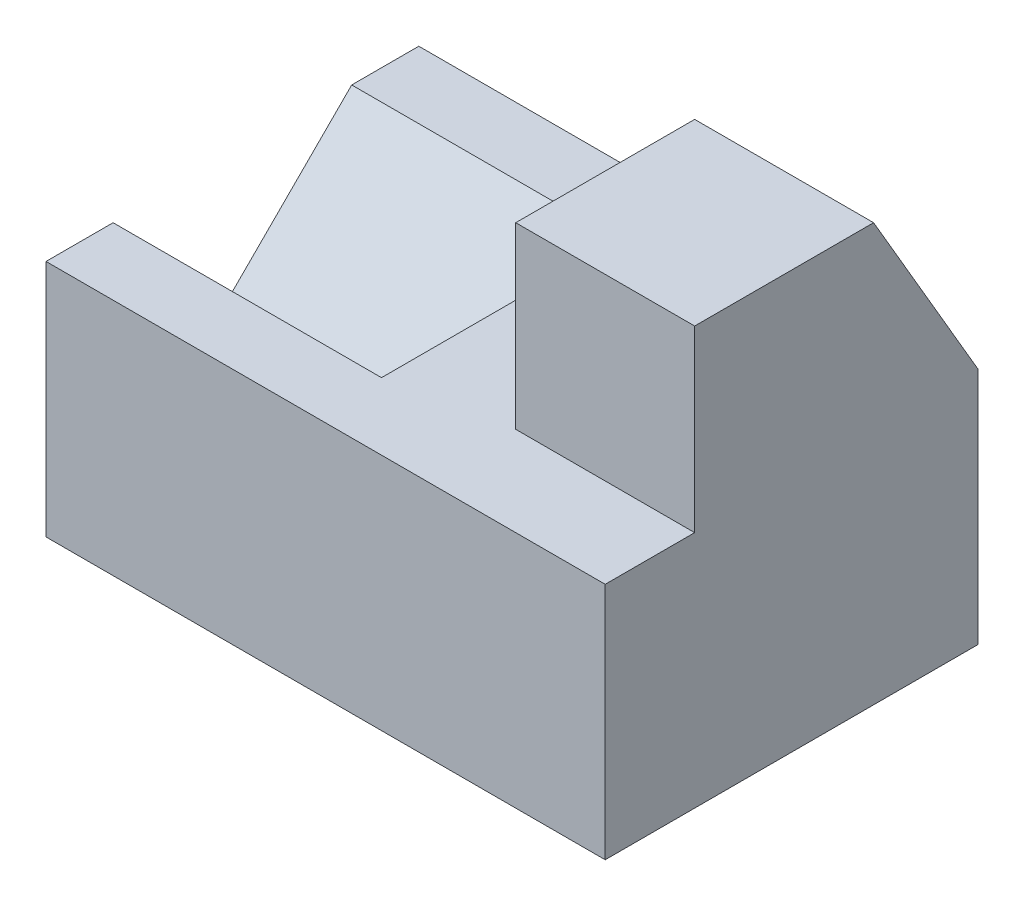
ISO-10303-21;
HEADER;
FILE_DESCRIPTION(('STEP AP214'),'2;1');
FILE_NAME('part.step','',(''),(''),'','','');
FILE_SCHEMA(('AUTOMOTIVE_DESIGN { 1 0 10303 214 1 1 1 1 }'));
ENDSEC;
DATA;
#1=APPLICATION_CONTEXT('core data for automotive mechanical design processes');
#2=APPLICATION_PROTOCOL_DEFINITION('international standard','automotive_design',2000,#1);
#3=PRODUCT_CONTEXT('',#1,'mechanical');
#4=PRODUCT('Part','Part','',(#3));
#5=PRODUCT_RELATED_PRODUCT_CATEGORY('part','',(#4));
#6=PRODUCT_DEFINITION_FORMATION('','',#4);
#7=PRODUCT_DEFINITION_CONTEXT('part definition',#1,'design');
#8=PRODUCT_DEFINITION('design','',#6,#7);
#9=PRODUCT_DEFINITION_SHAPE('','',#8);
#10=(LENGTH_UNIT() NAMED_UNIT(*) SI_UNIT(.MILLI.,.METRE.));
#11=(NAMED_UNIT(*) PLANE_ANGLE_UNIT() SI_UNIT($,.RADIAN.));
#12=(NAMED_UNIT(*) SI_UNIT($,.STERADIAN.) SOLID_ANGLE_UNIT());
#13=UNCERTAINTY_MEASURE_WITH_UNIT(LENGTH_MEASURE(1.E-05),#10,'distance_accuracy_value','');
#14=(GEOMETRIC_REPRESENTATION_CONTEXT(3) GLOBAL_UNCERTAINTY_ASSIGNED_CONTEXT((#13)) GLOBAL_UNIT_ASSIGNED_CONTEXT((#10,
#11,#12)) REPRESENTATION_CONTEXT('',''));
#15=CARTESIAN_POINT('',(0.,0.,0.));
#16=DIRECTION('',(0.,0.,1.));
#17=DIRECTION('',(1.,0.,0.));
#18=AXIS2_PLACEMENT_3D('',#15,#16,#17);
#19=CARTESIAN_POINT('',(-75.,0.,25.));
#20=DIRECTION('',(0.,0.,-1.));
#21=DIRECTION('',(-1.,0.,0.));
#22=AXIS2_PLACEMENT_3D('',#19,#20,#21);
#23=PLANE('',#22);
#24=DIRECTION('',(0.,1.,0.));
#25=VECTOR('',#24,1.);
#26=CARTESIAN_POINT('',(0.,0.,25.));
#27=LINE('',#26,#25);
#28=CARTESIAN_POINT('',(0.,-16.,25.));
#29=VERTEX_POINT('',#28);
#30=CARTESIAN_POINT('',(0.,16.,25.));
#31=VERTEX_POINT('',#30);
#32=EDGE_CURVE('E186',#29,#31,#27,.T.);
#33=ORIENTED_EDGE('',*,*,#32,.T.);
#34=DIRECTION('',(1.,0.,0.));
#35=VECTOR('',#34,1.);
#36=CARTESIAN_POINT('',(-75.,16.,25.));
#37=LINE('',#36,#35);
#38=CARTESIAN_POINT('',(-75.,16.,25.));
#39=VERTEX_POINT('',#38);
#40=EDGE_CURVE('E11',#39,#31,#37,.T.);
#41=ORIENTED_EDGE('',*,*,#40,.F.);
#42=DIRECTION('',(0.,1.,0.));
#43=VECTOR('',#42,1.);
#44=CARTESIAN_POINT('',(-75.,0.,25.));
#45=LINE('',#44,#43);
#46=CARTESIAN_POINT('',(-75.,-16.,25.));
#47=VERTEX_POINT('',#46);
#48=EDGE_CURVE('E196',#47,#39,#45,.T.);
#49=ORIENTED_EDGE('',*,*,#48,.F.);
#50=DIRECTION('',(1.,0.,0.));
#51=VECTOR('',#50,1.);
#52=CARTESIAN_POINT('',(-75.,-16.,25.));
#53=LINE('',#52,#51);
#54=EDGE_CURVE('E48',#47,#29,#53,.T.);
#55=ORIENTED_EDGE('',*,*,#54,.T.);
#56=EDGE_LOOP('',(#33,#41,#49,#55));
#57=FACE_BOUND('',#56,.T.);
#58=ADVANCED_FACE('F45',(#57),#23,.F.);
#59=CARTESIAN_POINT('',(-75.,16.,0.));
#60=DIRECTION('',(0.,1.,0.));
#61=DIRECTION('',(0.,0.,1.));
#62=AXIS2_PLACEMENT_3D('',#59,#60,#61);
#63=PLANE('',#62);
#64=DIRECTION('',(-1.,0.,0.));
#65=VECTOR('',#64,1.);
#66=CARTESIAN_POINT('',(-39.,16.,16.));
#67=LINE('',#66,#65);
#68=CARTESIAN_POINT('',(-39.,16.,16.));
#69=VERTEX_POINT('',#68);
#70=CARTESIAN_POINT('',(-75.,16.,16.));
#71=VERTEX_POINT('',#70);
#72=EDGE_CURVE('E151',#69,#71,#67,.T.);
#73=ORIENTED_EDGE('',*,*,#72,.T.);
#74=DIRECTION('',(0.,0.,1.));
#75=VECTOR('',#74,1.);
#76=CARTESIAN_POINT('',(-75.,16.,0.));
#77=LINE('',#76,#75);
#78=EDGE_CURVE('E208',#71,#39,#77,.T.);
#79=ORIENTED_EDGE('',*,*,#78,.T.);
#80=ORIENTED_EDGE('',*,*,#40,.T.);
#81=DIRECTION('',(0.,0.,1.));
#82=VECTOR('',#81,1.);
#83=CARTESIAN_POINT('',(0.,16.,0.));
#84=LINE('',#83,#82);
#85=CARTESIAN_POINT('',(0.,16.,13.));
#86=VERTEX_POINT('',#85);
#87=EDGE_CURVE('E201',#86,#31,#84,.T.);
#88=ORIENTED_EDGE('',*,*,#87,.F.);
#89=DIRECTION('',(1.,0.,0.));
#90=VECTOR('',#89,1.);
#91=CARTESIAN_POINT('',(-24.,16.,13.));
#92=LINE('',#91,#90);
#93=CARTESIAN_POINT('',(-24.,16.,13.));
#94=VERTEX_POINT('',#93);
#95=EDGE_CURVE('E190',#94,#86,#92,.T.);
#96=ORIENTED_EDGE('',*,*,#95,.F.);
#97=DIRECTION('',(0.,0.,1.));
#98=VECTOR('',#97,1.);
#99=CARTESIAN_POINT('',(-24.,16.,0.));
#100=LINE('',#99,#98);
#101=CARTESIAN_POINT('',(-24.,16.,-25.));
#102=VERTEX_POINT('',#101);
#103=EDGE_CURVE('E70',#102,#94,#100,.T.);
#104=ORIENTED_EDGE('',*,*,#103,.F.);
#105=DIRECTION('',(1.,0.,0.));
#106=VECTOR('',#105,1.);
#107=CARTESIAN_POINT('',(-75.,16.,-25.));
#108=LINE('',#107,#106);
#109=CARTESIAN_POINT('',(-75.,16.,-25.));
#110=VERTEX_POINT('',#109);
#111=EDGE_CURVE('E54',#110,#102,#108,.T.);
#112=ORIENTED_EDGE('',*,*,#111,.F.);
#113=CARTESIAN_POINT('',(-75.,16.,-16.));
#114=VERTEX_POINT('',#113);
#115=EDGE_CURVE('E146',#110,#114,#77,.T.);
#116=ORIENTED_EDGE('',*,*,#115,.T.);
#117=DIRECTION('',(-1.,0.,0.));
#118=VECTOR('',#117,1.);
#119=CARTESIAN_POINT('',(-39.,16.,-16.));
#120=LINE('',#119,#118);
#121=CARTESIAN_POINT('',(-39.,16.,-16.));
#122=VERTEX_POINT('',#121);
#123=EDGE_CURVE('E62',#122,#114,#120,.T.);
#124=ORIENTED_EDGE('',*,*,#123,.F.);
#125=DIRECTION('',(0.,0.,-1.));
#126=VECTOR('',#125,1.);
#127=CARTESIAN_POINT('',(-39.,16.,16.));
#128=LINE('',#127,#126);
#129=EDGE_CURVE('E135',#69,#122,#128,.T.);
#130=ORIENTED_EDGE('',*,*,#129,.F.);
#131=EDGE_LOOP('',(#73,#79,#80,#88,#96,#104,#112,#116,#124,#130));
#132=FACE_BOUND('',#131,.T.);
#133=ADVANCED_FACE('F144',(#132),#63,.T.);
#134=CARTESIAN_POINT('',(-75.,0.,-25.));
#135=DIRECTION('',(0.,0.,-1.));
#136=DIRECTION('',(-1.,0.,0.));
#137=AXIS2_PLACEMENT_3D('',#134,#135,#136);
#138=PLANE('',#137);
#139=DIRECTION('',(0.,1.,0.));
#140=VECTOR('',#139,1.);
#141=CARTESIAN_POINT('',(0.,0.,-25.));
#142=LINE('',#141,#140);
#143=CARTESIAN_POINT('',(0.,-16.,-25.));
#144=VERTEX_POINT('',#143);
#145=CARTESIAN_POINT('',(0.,16.,-25.));
#146=VERTEX_POINT('',#145);
#147=EDGE_CURVE('E217',#144,#146,#142,.T.);
#148=ORIENTED_EDGE('',*,*,#147,.F.);
#149=DIRECTION('',(1.,0.,0.));
#150=VECTOR('',#149,1.);
#151=CARTESIAN_POINT('',(-75.,-16.,-25.));
#152=LINE('',#151,#150);
#153=CARTESIAN_POINT('',(-75.,-16.,-25.));
#154=VERTEX_POINT('',#153);
#155=EDGE_CURVE('E224',#154,#144,#152,.T.);
#156=ORIENTED_EDGE('',*,*,#155,.F.);
#157=DIRECTION('',(0.,1.,0.));
#158=VECTOR('',#157,1.);
#159=CARTESIAN_POINT('',(-75.,0.,-25.));
#160=LINE('',#159,#158);
#161=EDGE_CURVE('E204',#154,#110,#160,.T.);
#162=ORIENTED_EDGE('',*,*,#161,.T.);
#163=ORIENTED_EDGE('',*,*,#111,.T.);
#164=DIRECTION('',(1.,0.,0.));
#165=VECTOR('',#164,1.);
#166=CARTESIAN_POINT('',(-24.,16.,-25.));
#167=LINE('',#166,#165);
#168=EDGE_CURVE('E187',#102,#146,#167,.T.);
#169=ORIENTED_EDGE('',*,*,#168,.T.);
#170=EDGE_LOOP('',(#148,#156,#162,#163,#169));
#171=FACE_BOUND('',#170,.T.);
#172=ADVANCED_FACE('F248',(#171),#138,.T.);
#173=CARTESIAN_POINT('',(-75.,-16.,0.));
#174=DIRECTION('',(0.,1.,0.));
#175=DIRECTION('',(0.,0.,1.));
#176=AXIS2_PLACEMENT_3D('',#173,#174,#175);
#177=PLANE('',#176);
#178=DIRECTION('',(0.,0.,1.));
#179=VECTOR('',#178,1.);
#180=CARTESIAN_POINT('',(0.,-16.,0.));
#181=LINE('',#180,#179);
#182=EDGE_CURVE('E214',#144,#29,#181,.T.);
#183=ORIENTED_EDGE('',*,*,#182,.T.);
#184=ORIENTED_EDGE('',*,*,#54,.F.);
#185=DIRECTION('',(0.,0.,1.));
#186=VECTOR('',#185,1.);
#187=CARTESIAN_POINT('',(-75.,-16.,0.));
#188=LINE('',#187,#186);
#189=EDGE_CURVE('E200',#154,#47,#188,.T.);
#190=ORIENTED_EDGE('',*,*,#189,.F.);
#191=ORIENTED_EDGE('',*,*,#155,.T.);
#192=EDGE_LOOP('',(#183,#184,#190,#191));
#193=FACE_BOUND('',#192,.T.);
#194=ADVANCED_FACE('F246',(#193),#177,.F.);
#195=CARTESIAN_POINT('',(-75.,0.,0.));
#196=DIRECTION('',(1.,0.,0.));
#197=DIRECTION('',(0.,0.,-1.));
#198=AXIS2_PLACEMENT_3D('',#195,#196,#197);
#199=PLANE('',#198);
#200=ORIENTED_EDGE('',*,*,#78,.F.);
#201=DIRECTION('',(0.,0.707106781186548,0.707106781186548));
#202=VECTOR('',#201,1.);
#203=CARTESIAN_POINT('',(-75.,0.,0.));
#204=LINE('',#203,#202);
#205=CARTESIAN_POINT('',(-75.,0.,0.));
#206=VERTEX_POINT('',#205);
#207=EDGE_CURVE('E141',#206,#71,#204,.T.);
#208=ORIENTED_EDGE('',*,*,#207,.F.);
#209=DIRECTION('',(0.,-0.707106781186548,0.707106781186548));
#210=VECTOR('',#209,1.);
#211=CARTESIAN_POINT('',(-75.,16.,-16.));
#212=LINE('',#211,#210);
#213=EDGE_CURVE('E391',#114,#206,#212,.T.);
#214=ORIENTED_EDGE('',*,*,#213,.F.);
#215=ORIENTED_EDGE('',*,*,#115,.F.);
#216=ORIENTED_EDGE('',*,*,#161,.F.);
#217=ORIENTED_EDGE('',*,*,#189,.T.);
#218=ORIENTED_EDGE('',*,*,#48,.T.);
#219=EDGE_LOOP('',(#200,#208,#214,#215,#216,#217,#218));
#220=FACE_BOUND('',#219,.T.);
#221=ADVANCED_FACE('F244',(#220),#199,.F.);
#222=CARTESIAN_POINT('',(0.,0.,0.));
#223=DIRECTION('',(1.,0.,0.));
#224=DIRECTION('',(0.,0.,-1.));
#225=AXIS2_PLACEMENT_3D('',#222,#223,#224);
#226=PLANE('',#225);
#227=ORIENTED_EDGE('',*,*,#32,.F.);
#228=ORIENTED_EDGE('',*,*,#182,.F.);
#229=ORIENTED_EDGE('',*,*,#147,.T.);
#230=DIRECTION('',(0.,0.863778900898433,0.503871025524086));
#231=VECTOR('',#230,1.);
#232=CARTESIAN_POINT('',(0.,14.9430051813472,-25.6165803108808));
#233=LINE('',#232,#231);
#234=CARTESIAN_POINT('',(0.,40.,-11.));
#235=VERTEX_POINT('',#234);
#236=EDGE_CURVE('E161',#146,#235,#233,.T.);
#237=ORIENTED_EDGE('',*,*,#236,.T.);
#238=DIRECTION('',(0.,0.,1.));
#239=VECTOR('',#238,1.);
#240=CARTESIAN_POINT('',(0.,40.,0.));
#241=LINE('',#240,#239);
#242=CARTESIAN_POINT('',(0.,40.,13.));
#243=VERTEX_POINT('',#242);
#244=EDGE_CURVE('E172',#235,#243,#241,.T.);
#245=ORIENTED_EDGE('',*,*,#244,.T.);
#246=DIRECTION('',(0.,-1.,0.));
#247=VECTOR('',#246,1.);
#248=CARTESIAN_POINT('',(0.,0.,13.));
#249=LINE('',#248,#247);
#250=EDGE_CURVE('E176',#243,#86,#249,.T.);
#251=ORIENTED_EDGE('',*,*,#250,.T.);
#252=ORIENTED_EDGE('',*,*,#87,.T.);
#253=EDGE_LOOP('',(#227,#228,#229,#237,#245,#251,#252));
#254=FACE_BOUND('',#253,.T.);
#255=ADVANCED_FACE('F237',(#254),#226,.T.);
#256=CARTESIAN_POINT('',(-24.,40.,0.));
#257=DIRECTION('',(0.,1.,0.));
#258=DIRECTION('',(0.,0.,1.));
#259=AXIS2_PLACEMENT_3D('',#256,#257,#258);
#260=PLANE('',#259);
#261=ORIENTED_EDGE('',*,*,#244,.F.);
#262=DIRECTION('',(1.,0.,0.));
#263=VECTOR('',#262,1.);
#264=CARTESIAN_POINT('',(-24.,40.,-11.));
#265=LINE('',#264,#263);
#266=CARTESIAN_POINT('',(-24.,40.,-11.));
#267=VERTEX_POINT('',#266);
#268=EDGE_CURVE('E183',#267,#235,#265,.T.);
#269=ORIENTED_EDGE('',*,*,#268,.F.);
#270=DIRECTION('',(0.,0.,1.));
#271=VECTOR('',#270,1.);
#272=CARTESIAN_POINT('',(-24.,40.,0.));
#273=LINE('',#272,#271);
#274=CARTESIAN_POINT('',(-24.,40.,13.));
#275=VERTEX_POINT('',#274);
#276=EDGE_CURVE('E156',#267,#275,#273,.T.);
#277=ORIENTED_EDGE('',*,*,#276,.T.);
#278=DIRECTION('',(1.,0.,0.));
#279=VECTOR('',#278,1.);
#280=CARTESIAN_POINT('',(-24.,40.,13.));
#281=LINE('',#280,#279);
#282=EDGE_CURVE('E171',#275,#243,#281,.T.);
#283=ORIENTED_EDGE('',*,*,#282,.T.);
#284=EDGE_LOOP('',(#261,#269,#277,#283));
#285=FACE_BOUND('',#284,.T.);
#286=ADVANCED_FACE('F265',(#285),#260,.T.);
#287=CARTESIAN_POINT('',(-24.,14.9430051813472,-25.6165803108808));
#288=DIRECTION('',(0.,0.503871025524086,-0.863778900898433));
#289=DIRECTION('',(0.,0.863778900898433,0.503871025524086));
#290=AXIS2_PLACEMENT_3D('',#287,#288,#289);
#291=PLANE('',#290);
#292=ORIENTED_EDGE('',*,*,#236,.F.);
#293=ORIENTED_EDGE('',*,*,#168,.F.);
#294=DIRECTION('',(0.,0.863778900898433,0.503871025524086));
#295=VECTOR('',#294,1.);
#296=CARTESIAN_POINT('',(-24.,14.9430051813472,-25.6165803108808));
#297=LINE('',#296,#295);
#298=EDGE_CURVE('E167',#102,#267,#297,.T.);
#299=ORIENTED_EDGE('',*,*,#298,.T.);
#300=ORIENTED_EDGE('',*,*,#268,.T.);
#301=EDGE_LOOP('',(#292,#293,#299,#300));
#302=FACE_BOUND('',#301,.T.);
#303=ADVANCED_FACE('F269',(#302),#291,.T.);
#304=CARTESIAN_POINT('',(-24.,0.,13.));
#305=DIRECTION('',(0.,0.,1.));
#306=DIRECTION('',(0.,-1.,0.));
#307=AXIS2_PLACEMENT_3D('',#304,#305,#306);
#308=PLANE('',#307);
#309=ORIENTED_EDGE('',*,*,#250,.F.);
#310=ORIENTED_EDGE('',*,*,#282,.F.);
#311=DIRECTION('',(0.,-1.,0.));
#312=VECTOR('',#311,1.);
#313=CARTESIAN_POINT('',(-24.,0.,13.));
#314=LINE('',#313,#312);
#315=EDGE_CURVE('E160',#275,#94,#314,.T.);
#316=ORIENTED_EDGE('',*,*,#315,.T.);
#317=ORIENTED_EDGE('',*,*,#95,.T.);
#318=EDGE_LOOP('',(#309,#310,#316,#317));
#319=FACE_BOUND('',#318,.T.);
#320=ADVANCED_FACE('F271',(#319),#308,.T.);
#321=CARTESIAN_POINT('',(-24.,0.,0.));
#322=DIRECTION('',(1.,0.,0.));
#323=DIRECTION('',(0.,0.,-1.));
#324=AXIS2_PLACEMENT_3D('',#321,#322,#323);
#325=PLANE('',#324);
#326=ORIENTED_EDGE('',*,*,#276,.F.);
#327=ORIENTED_EDGE('',*,*,#298,.F.);
#328=ORIENTED_EDGE('',*,*,#103,.T.);
#329=ORIENTED_EDGE('',*,*,#315,.F.);
#330=EDGE_LOOP('',(#326,#327,#328,#329));
#331=FACE_BOUND('',#330,.T.);
#332=ADVANCED_FACE('F274',(#331),#325,.F.);
#333=CARTESIAN_POINT('',(-39.,0.,0.));
#334=DIRECTION('',(0.,-0.707106781186547,0.707106781186547));
#335=DIRECTION('',(0.,-0.707106781186548,-0.707106781186548));
#336=AXIS2_PLACEMENT_3D('',#333,#334,#335);
#337=PLANE('',#336);
#338=ORIENTED_EDGE('',*,*,#207,.T.);
#339=ORIENTED_EDGE('',*,*,#72,.F.);
#340=DIRECTION('',(0.,0.707106781186548,0.707106781186548));
#341=VECTOR('',#340,1.);
#342=CARTESIAN_POINT('',(-39.,0.,0.));
#343=LINE('',#342,#341);
#344=CARTESIAN_POINT('',(-39.,0.,0.));
#345=VERTEX_POINT('',#344);
#346=EDGE_CURVE('E134',#345,#69,#343,.T.);
#347=ORIENTED_EDGE('',*,*,#346,.F.);
#348=DIRECTION('',(-1.,0.,0.));
#349=VECTOR('',#348,1.);
#350=CARTESIAN_POINT('',(-39.,0.,0.));
#351=LINE('',#350,#349);
#352=EDGE_CURVE('E129',#345,#206,#351,.T.);
#353=ORIENTED_EDGE('',*,*,#352,.T.);
#354=EDGE_LOOP('',(#338,#339,#347,#353));
#355=FACE_BOUND('',#354,.T.);
#356=ADVANCED_FACE('F281',(#355),#337,.F.);
#357=CARTESIAN_POINT('',(-39.,16.,-16.));
#358=DIRECTION('',(0.,-0.707106781186547,-0.707106781186547));
#359=DIRECTION('',(0.,0.707106781186548,-0.707106781186548));
#360=AXIS2_PLACEMENT_3D('',#357,#358,#359);
#361=PLANE('',#360);
#362=ORIENTED_EDGE('',*,*,#213,.T.);
#363=ORIENTED_EDGE('',*,*,#352,.F.);
#364=DIRECTION('',(0.,-0.707106781186548,0.707106781186548));
#365=VECTOR('',#364,1.);
#366=CARTESIAN_POINT('',(-39.,16.,-16.));
#367=LINE('',#366,#365);
#368=EDGE_CURVE('E126',#122,#345,#367,.T.);
#369=ORIENTED_EDGE('',*,*,#368,.F.);
#370=ORIENTED_EDGE('',*,*,#123,.T.);
#371=EDGE_LOOP('',(#362,#363,#369,#370));
#372=FACE_BOUND('',#371,.T.);
#373=ADVANCED_FACE('F128',(#372),#361,.F.);
#374=CARTESIAN_POINT('',(-39.,0.,0.));
#375=DIRECTION('',(-1.,0.,0.));
#376=DIRECTION('',(0.,0.,1.));
#377=AXIS2_PLACEMENT_3D('',#374,#375,#376);
#378=PLANE('',#377);
#379=ORIENTED_EDGE('',*,*,#129,.T.);
#380=ORIENTED_EDGE('',*,*,#368,.T.);
#381=ORIENTED_EDGE('',*,*,#346,.T.);
#382=EDGE_LOOP('',(#379,#380,#381));
#383=FACE_BOUND('',#382,.T.);
#384=ADVANCED_FACE('F138',(#383),#378,.T.);
#385=CLOSED_SHELL('',(#58,#133,#172,#194,#221,#255,#286,#303,#320,#332,#356,#373,#384));
#386=MANIFOLD_SOLID_BREP('B2',#385);
#387=ADVANCED_BREP_SHAPE_REPRESENTATION('',(#18,#386),#14);
#388=SHAPE_DEFINITION_REPRESENTATION(#9,#387);
ENDSEC;
END-ISO-10303-21;
